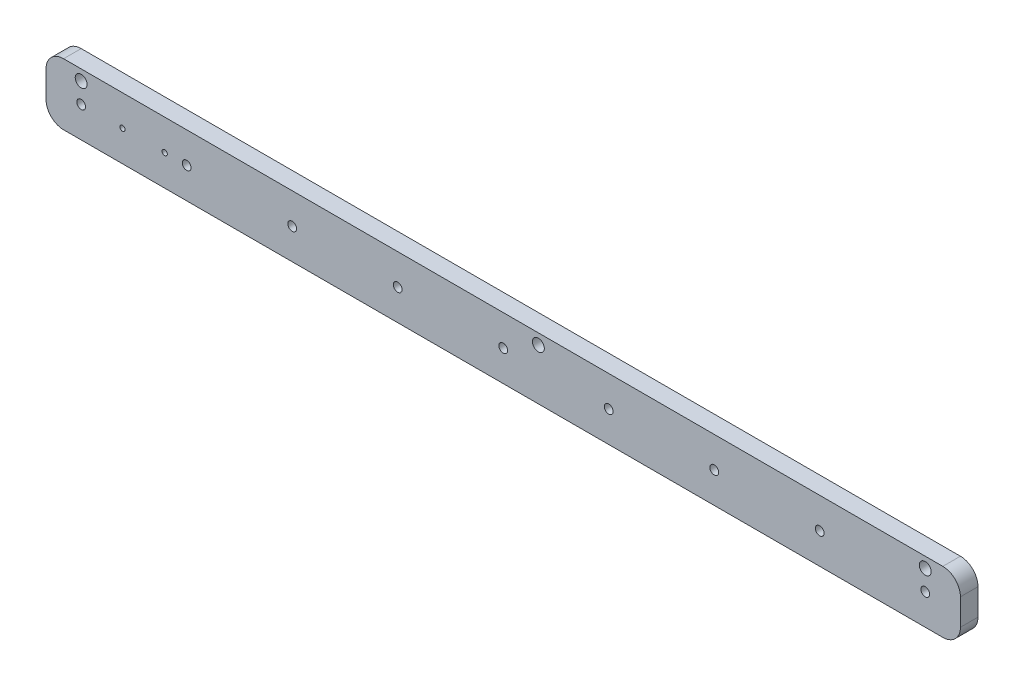
ISO-10303-21;
HEADER;
FILE_DESCRIPTION(('STEP AP214'),'2;1');
FILE_NAME('part.step','',(''),(''),'','','');
FILE_SCHEMA(('AUTOMOTIVE_DESIGN { 1 0 10303 214 1 1 1 1 }'));
ENDSEC;
DATA;
#1=APPLICATION_CONTEXT('core data for automotive mechanical design processes');
#2=APPLICATION_PROTOCOL_DEFINITION('international standard','automotive_design',2000,#1);
#3=PRODUCT_CONTEXT('',#1,'mechanical');
#4=PRODUCT('Part','Part','',(#3));
#5=PRODUCT_RELATED_PRODUCT_CATEGORY('part','',(#4));
#6=PRODUCT_DEFINITION_FORMATION('','',#4);
#7=PRODUCT_DEFINITION_CONTEXT('part definition',#1,'design');
#8=PRODUCT_DEFINITION('design','',#6,#7);
#9=PRODUCT_DEFINITION_SHAPE('','',#8);
#10=(LENGTH_UNIT() NAMED_UNIT(*) SI_UNIT(.MILLI.,.METRE.));
#11=(NAMED_UNIT(*) PLANE_ANGLE_UNIT() SI_UNIT($,.RADIAN.));
#12=(NAMED_UNIT(*) SI_UNIT($,.STERADIAN.) SOLID_ANGLE_UNIT());
#13=UNCERTAINTY_MEASURE_WITH_UNIT(LENGTH_MEASURE(1.E-05),#10,'distance_accuracy_value','');
#14=(GEOMETRIC_REPRESENTATION_CONTEXT(3) GLOBAL_UNCERTAINTY_ASSIGNED_CONTEXT((#13)) GLOBAL_UNIT_ASSIGNED_CONTEXT((#10,
#11,#12)) REPRESENTATION_CONTEXT('',''));
#15=CARTESIAN_POINT('',(0.,0.,0.));
#16=DIRECTION('',(0.,0.,1.));
#17=DIRECTION('',(1.,0.,0.));
#18=AXIS2_PLACEMENT_3D('',#15,#16,#17);
#19=CARTESIAN_POINT('',(240.,0.,10.));
#20=DIRECTION('',(0.,0.,-1.));
#21=DIRECTION('',(-1.,0.,0.));
#22=AXIS2_PLACEMENT_3D('',#19,#20,#21);
#23=CYLINDRICAL_SURFACE('',#22,6.99999999999998);
#24=CARTESIAN_POINT('',(240.,0.,0.));
#25=DIRECTION('',(0.,0.,1.));
#26=DIRECTION('',(1.,0.,0.));
#27=AXIS2_PLACEMENT_3D('',#24,#25,#26);
#28=CIRCLE('',#27,6.99999999999998);
#29=CARTESIAN_POINT('',(247.,0.,0.));
#30=VERTEX_POINT('',#29);
#31=EDGE_CURVE('E203',#30,#30,#28,.T.);
#32=ORIENTED_EDGE('',*,*,#31,.F.);
#33=EDGE_LOOP('',(#32));
#34=FACE_BOUND('',#33,.T.);
#35=CARTESIAN_POINT('',(240.,0.,6.));
#36=DIRECTION('',(0.,0.,1.));
#37=DIRECTION('',(1.,0.,0.));
#38=AXIS2_PLACEMENT_3D('',#35,#36,#37);
#39=CIRCLE('',#38,7.00000000000001);
#40=CARTESIAN_POINT('',(247.,0.,6.));
#41=VERTEX_POINT('',#40);
#42=EDGE_CURVE('E276',#41,#41,#39,.T.);
#43=ORIENTED_EDGE('',*,*,#42,.T.);
#44=EDGE_LOOP('',(#43));
#45=FACE_BOUND('',#44,.T.);
#46=ADVANCED_FACE('F33',(#34,#45),#23,.F.);
#47=CARTESIAN_POINT('',(180.,0.,10.));
#48=DIRECTION('',(0.,0.,-1.));
#49=DIRECTION('',(-1.,0.,0.));
#50=AXIS2_PLACEMENT_3D('',#47,#48,#49);
#51=CYLINDRICAL_SURFACE('',#50,6.99999999999998);
#52=CARTESIAN_POINT('',(180.,0.,0.));
#53=DIRECTION('',(0.,0.,1.));
#54=DIRECTION('',(1.,0.,0.));
#55=AXIS2_PLACEMENT_3D('',#52,#53,#54);
#56=CIRCLE('',#55,6.99999999999998);
#57=CARTESIAN_POINT('',(187.,0.,0.));
#58=VERTEX_POINT('',#57);
#59=EDGE_CURVE('E200',#58,#58,#56,.T.);
#60=ORIENTED_EDGE('',*,*,#59,.F.);
#61=EDGE_LOOP('',(#60));
#62=FACE_BOUND('',#61,.T.);
#63=CARTESIAN_POINT('',(180.,0.,6.));
#64=DIRECTION('',(0.,0.,1.));
#65=DIRECTION('',(1.,0.,0.));
#66=AXIS2_PLACEMENT_3D('',#63,#64,#65);
#67=CIRCLE('',#66,7.00000000000001);
#68=CARTESIAN_POINT('',(187.,0.,6.));
#69=VERTEX_POINT('',#68);
#70=EDGE_CURVE('E267',#69,#69,#67,.T.);
#71=ORIENTED_EDGE('',*,*,#70,.T.);
#72=EDGE_LOOP('',(#71));
#73=FACE_BOUND('',#72,.T.);
#74=ADVANCED_FACE('F357',(#62,#73),#51,.F.);
#75=CARTESIAN_POINT('',(120.,0.,10.));
#76=DIRECTION('',(0.,0.,-1.));
#77=DIRECTION('',(-1.,0.,0.));
#78=AXIS2_PLACEMENT_3D('',#75,#76,#77);
#79=CYLINDRICAL_SURFACE('',#78,7.00000000000001);
#80=CARTESIAN_POINT('',(120.,0.,0.));
#81=DIRECTION('',(0.,0.,1.));
#82=DIRECTION('',(1.,0.,0.));
#83=AXIS2_PLACEMENT_3D('',#80,#81,#82);
#84=CIRCLE('',#83,7.00000000000001);
#85=CARTESIAN_POINT('',(127.,0.,0.));
#86=VERTEX_POINT('',#85);
#87=EDGE_CURVE('E197',#86,#86,#84,.T.);
#88=ORIENTED_EDGE('',*,*,#87,.F.);
#89=EDGE_LOOP('',(#88));
#90=FACE_BOUND('',#89,.T.);
#91=CARTESIAN_POINT('',(120.,0.,6.));
#92=DIRECTION('',(0.,0.,1.));
#93=DIRECTION('',(1.,0.,0.));
#94=AXIS2_PLACEMENT_3D('',#91,#92,#93);
#95=CIRCLE('',#94,7.00000000000001);
#96=CARTESIAN_POINT('',(127.,0.,6.));
#97=VERTEX_POINT('',#96);
#98=EDGE_CURVE('E258',#97,#97,#95,.T.);
#99=ORIENTED_EDGE('',*,*,#98,.T.);
#100=EDGE_LOOP('',(#99));
#101=FACE_BOUND('',#100,.T.);
#102=ADVANCED_FACE('F363',(#90,#101),#79,.F.);
#103=CARTESIAN_POINT('',(60.0000000000001,0.,10.));
#104=DIRECTION('',(0.,0.,-1.));
#105=DIRECTION('',(-1.,0.,0.));
#106=AXIS2_PLACEMENT_3D('',#103,#104,#105);
#107=CYLINDRICAL_SURFACE('',#106,7.00000000000002);
#108=CARTESIAN_POINT('',(60.0000000000001,0.,0.));
#109=DIRECTION('',(0.,0.,1.));
#110=DIRECTION('',(1.,0.,0.));
#111=AXIS2_PLACEMENT_3D('',#108,#109,#110);
#112=CIRCLE('',#111,7.00000000000002);
#113=CARTESIAN_POINT('',(67.0000000000001,0.,0.));
#114=VERTEX_POINT('',#113);
#115=EDGE_CURVE('E194',#114,#114,#112,.T.);
#116=ORIENTED_EDGE('',*,*,#115,.F.);
#117=EDGE_LOOP('',(#116));
#118=FACE_BOUND('',#117,.T.);
#119=CARTESIAN_POINT('',(60.0000000000001,0.,6.));
#120=DIRECTION('',(0.,0.,1.));
#121=DIRECTION('',(1.,0.,0.));
#122=AXIS2_PLACEMENT_3D('',#119,#120,#121);
#123=CIRCLE('',#122,7.00000000000002);
#124=CARTESIAN_POINT('',(67.0000000000001,0.,6.));
#125=VERTEX_POINT('',#124);
#126=EDGE_CURVE('E249',#125,#125,#123,.T.);
#127=ORIENTED_EDGE('',*,*,#126,.T.);
#128=EDGE_LOOP('',(#127));
#129=FACE_BOUND('',#128,.T.);
#130=ADVANCED_FACE('F374',(#118,#129),#107,.F.);
#131=CARTESIAN_POINT('',(0.,0.,10.));
#132=DIRECTION('',(0.,0.,-1.));
#133=DIRECTION('',(-1.,0.,0.));
#134=AXIS2_PLACEMENT_3D('',#131,#132,#133);
#135=CYLINDRICAL_SURFACE('',#134,7.);
#136=CARTESIAN_POINT('',(0.,0.,0.));
#137=DIRECTION('',(0.,0.,1.));
#138=DIRECTION('',(1.,0.,0.));
#139=AXIS2_PLACEMENT_3D('',#136,#137,#138);
#140=CIRCLE('',#139,7.);
#141=CARTESIAN_POINT('',(7.00000000000006,0.,0.));
#142=VERTEX_POINT('',#141);
#143=EDGE_CURVE('E191',#142,#142,#140,.T.);
#144=ORIENTED_EDGE('',*,*,#143,.F.);
#145=EDGE_LOOP('',(#144));
#146=FACE_BOUND('',#145,.T.);
#147=CARTESIAN_POINT('',(0.,0.,6.));
#148=DIRECTION('',(0.,0.,1.));
#149=DIRECTION('',(1.,0.,0.));
#150=AXIS2_PLACEMENT_3D('',#147,#148,#149);
#151=CIRCLE('',#150,7.00000000000002);
#152=CARTESIAN_POINT('',(7.00000000000007,0.,6.));
#153=VERTEX_POINT('',#152);
#154=EDGE_CURVE('E240',#153,#153,#151,.T.);
#155=ORIENTED_EDGE('',*,*,#154,.T.);
#156=EDGE_LOOP('',(#155));
#157=FACE_BOUND('',#156,.T.);
#158=ADVANCED_FACE('F378',(#146,#157),#135,.F.);
#159=CARTESIAN_POINT('',(-59.9999999999999,0.,10.));
#160=DIRECTION('',(0.,0.,-1.));
#161=DIRECTION('',(-1.,0.,0.));
#162=AXIS2_PLACEMENT_3D('',#159,#160,#161);
#163=CYLINDRICAL_SURFACE('',#162,7.00000000000001);
#164=CARTESIAN_POINT('',(-59.9999999999999,0.,0.));
#165=DIRECTION('',(0.,0.,1.));
#166=DIRECTION('',(1.,0.,0.));
#167=AXIS2_PLACEMENT_3D('',#164,#165,#166);
#168=CIRCLE('',#167,7.00000000000001);
#169=CARTESIAN_POINT('',(-52.9999999999999,0.,0.));
#170=VERTEX_POINT('',#169);
#171=EDGE_CURVE('E188',#170,#170,#168,.T.);
#172=ORIENTED_EDGE('',*,*,#171,.F.);
#173=EDGE_LOOP('',(#172));
#174=FACE_BOUND('',#173,.T.);
#175=CARTESIAN_POINT('',(-59.9999999999999,0.,6.));
#176=DIRECTION('',(0.,0.,1.));
#177=DIRECTION('',(1.,0.,0.));
#178=AXIS2_PLACEMENT_3D('',#175,#176,#177);
#179=CIRCLE('',#178,7.00000000000001);
#180=CARTESIAN_POINT('',(-52.9999999999999,0.,6.));
#181=VERTEX_POINT('',#180);
#182=EDGE_CURVE('E231',#181,#181,#179,.T.);
#183=ORIENTED_EDGE('',*,*,#182,.T.);
#184=EDGE_LOOP('',(#183));
#185=FACE_BOUND('',#184,.T.);
#186=ADVANCED_FACE('F382',(#174,#185),#163,.F.);
#187=CARTESIAN_POINT('',(-120.,0.,10.));
#188=DIRECTION('',(0.,0.,-1.));
#189=DIRECTION('',(-1.,0.,0.));
#190=AXIS2_PLACEMENT_3D('',#187,#188,#189);
#191=CYLINDRICAL_SURFACE('',#190,7.00000000000002);
#192=CARTESIAN_POINT('',(-120.,0.,0.));
#193=DIRECTION('',(0.,0.,1.));
#194=DIRECTION('',(1.,0.,0.));
#195=AXIS2_PLACEMENT_3D('',#192,#193,#194);
#196=CIRCLE('',#195,7.00000000000002);
#197=CARTESIAN_POINT('',(-113.,0.,0.));
#198=VERTEX_POINT('',#197);
#199=EDGE_CURVE('E185',#198,#198,#196,.T.);
#200=ORIENTED_EDGE('',*,*,#199,.F.);
#201=EDGE_LOOP('',(#200));
#202=FACE_BOUND('',#201,.T.);
#203=CARTESIAN_POINT('',(-120.,0.,6.));
#204=DIRECTION('',(0.,0.,1.));
#205=DIRECTION('',(1.,0.,0.));
#206=AXIS2_PLACEMENT_3D('',#203,#204,#205);
#207=CIRCLE('',#206,7.00000000000002);
#208=CARTESIAN_POINT('',(-113.,0.,6.));
#209=VERTEX_POINT('',#208);
#210=EDGE_CURVE('E222',#209,#209,#207,.T.);
#211=ORIENTED_EDGE('',*,*,#210,.T.);
#212=EDGE_LOOP('',(#211));
#213=FACE_BOUND('',#212,.T.);
#214=ADVANCED_FACE('F386',(#202,#213),#191,.F.);
#215=CARTESIAN_POINT('',(-180.,0.,10.));
#216=DIRECTION('',(0.,0.,-1.));
#217=DIRECTION('',(-1.,0.,0.));
#218=AXIS2_PLACEMENT_3D('',#215,#216,#217);
#219=CYLINDRICAL_SURFACE('',#218,7.00000000000001);
#220=CARTESIAN_POINT('',(-180.,0.,0.));
#221=DIRECTION('',(0.,0.,1.));
#222=DIRECTION('',(1.,0.,0.));
#223=AXIS2_PLACEMENT_3D('',#220,#221,#222);
#224=CIRCLE('',#223,7.00000000000001);
#225=CARTESIAN_POINT('',(-173.,0.,0.));
#226=VERTEX_POINT('',#225);
#227=EDGE_CURVE('E182',#226,#226,#224,.T.);
#228=ORIENTED_EDGE('',*,*,#227,.F.);
#229=EDGE_LOOP('',(#228));
#230=FACE_BOUND('',#229,.T.);
#231=CARTESIAN_POINT('',(-180.,0.,6.));
#232=DIRECTION('',(0.,0.,1.));
#233=DIRECTION('',(1.,0.,0.));
#234=AXIS2_PLACEMENT_3D('',#231,#232,#233);
#235=CIRCLE('',#234,7.00000000000001);
#236=CARTESIAN_POINT('',(-173.,0.,6.));
#237=VERTEX_POINT('',#236);
#238=EDGE_CURVE('E213',#237,#237,#235,.T.);
#239=ORIENTED_EDGE('',*,*,#238,.T.);
#240=EDGE_LOOP('',(#239));
#241=FACE_BOUND('',#240,.T.);
#242=ADVANCED_FACE('F390',(#230,#241),#219,.F.);
#243=CARTESIAN_POINT('',(-240.,0.,10.));
#244=DIRECTION('',(0.,0.,-1.));
#245=DIRECTION('',(-1.,0.,0.));
#246=AXIS2_PLACEMENT_3D('',#243,#244,#245);
#247=CYLINDRICAL_SURFACE('',#246,7.00000000000001);
#248=CARTESIAN_POINT('',(-240.,0.,0.));
#249=DIRECTION('',(0.,0.,1.));
#250=DIRECTION('',(1.,0.,0.));
#251=AXIS2_PLACEMENT_3D('',#248,#249,#250);
#252=CIRCLE('',#251,7.00000000000001);
#253=CARTESIAN_POINT('',(-233.,0.,0.));
#254=VERTEX_POINT('',#253);
#255=EDGE_CURVE('E135',#254,#254,#252,.T.);
#256=ORIENTED_EDGE('',*,*,#255,.F.);
#257=EDGE_LOOP('',(#256));
#258=FACE_BOUND('',#257,.T.);
#259=CARTESIAN_POINT('',(-240.,0.,6.));
#260=DIRECTION('',(0.,0.,1.));
#261=DIRECTION('',(1.,0.,0.));
#262=AXIS2_PLACEMENT_3D('',#259,#260,#261);
#263=CIRCLE('',#262,7.00000000000001);
#264=CARTESIAN_POINT('',(-233.,0.,6.));
#265=VERTEX_POINT('',#264);
#266=EDGE_CURVE('E206',#265,#265,#263,.T.);
#267=ORIENTED_EDGE('',*,*,#266,.T.);
#268=EDGE_LOOP('',(#267));
#269=FACE_BOUND('',#268,.T.);
#270=ADVANCED_FACE('F329',(#258,#269),#247,.F.);
#271=CARTESIAN_POINT('',(250.,-7.5,10.));
#272=DIRECTION('',(0.,0.,1.));
#273=DIRECTION('',(1.,0.,0.));
#274=AXIS2_PLACEMENT_3D('',#271,#272,#273);
#275=PLANE('',#274);
#276=CARTESIAN_POINT('',(-192.499999843538,0.,10.));
#277=DIRECTION('',(0.,0.,1.));
#278=DIRECTION('',(1.,0.,0.));
#279=AXIS2_PLACEMENT_3D('',#276,#277,#278);
#280=CIRCLE('',#279,1.5);
#281=CARTESIAN_POINT('',(-190.999999843538,0.,10.));
#282=VERTEX_POINT('',#281);
#283=EDGE_CURVE('E312',#282,#282,#280,.T.);
#284=ORIENTED_EDGE('',*,*,#283,.F.);
#285=EDGE_LOOP('',(#284));
#286=FACE_BOUND('',#285,.T.);
#287=CARTESIAN_POINT('',(-216.499999843538,0.,10.));
#288=DIRECTION('',(0.,0.,1.));
#289=DIRECTION('',(1.,0.,0.));
#290=AXIS2_PLACEMENT_3D('',#287,#288,#289);
#291=CIRCLE('',#290,1.5);
#292=CARTESIAN_POINT('',(-214.999999843538,0.,10.));
#293=VERTEX_POINT('',#292);
#294=EDGE_CURVE('E306',#293,#293,#291,.T.);
#295=ORIENTED_EDGE('',*,*,#294,.F.);
#296=EDGE_LOOP('',(#295));
#297=FACE_BOUND('',#296,.T.);
#298=CARTESIAN_POINT('',(240.000000156462,11.5000003129244,10.));
#299=DIRECTION('',(0.,0.,1.));
#300=DIRECTION('',(1.,0.,0.));
#301=AXIS2_PLACEMENT_3D('',#298,#299,#300);
#302=CIRCLE('',#301,3.37499999999999);
#303=CARTESIAN_POINT('',(243.375000156462,11.5000003129244,10.));
#304=VERTEX_POINT('',#303);
#305=EDGE_CURVE('E300',#304,#304,#302,.T.);
#306=ORIENTED_EDGE('',*,*,#305,.F.);
#307=EDGE_LOOP('',(#306));
#308=FACE_BOUND('',#307,.T.);
#309=CARTESIAN_POINT('',(20.0000001564622,11.5000003129244,10.));
#310=DIRECTION('',(0.,0.,1.));
#311=DIRECTION('',(1.,0.,0.));
#312=AXIS2_PLACEMENT_3D('',#309,#310,#311);
#313=CIRCLE('',#312,3.37499999999996);
#314=CARTESIAN_POINT('',(23.3750001564621,11.5000003129244,10.));
#315=VERTEX_POINT('',#314);
#316=EDGE_CURVE('E295',#315,#315,#313,.T.);
#317=ORIENTED_EDGE('',*,*,#316,.F.);
#318=EDGE_LOOP('',(#317));
#319=FACE_BOUND('',#318,.T.);
#320=CARTESIAN_POINT('',(-239.999999843538,11.5000003129244,10.));
#321=DIRECTION('',(0.,0.,1.));
#322=DIRECTION('',(1.,0.,0.));
#323=AXIS2_PLACEMENT_3D('',#320,#321,#322);
#324=CIRCLE('',#323,3.37499999999999);
#325=CARTESIAN_POINT('',(-236.624999843538,11.5000003129244,10.));
#326=VERTEX_POINT('',#325);
#327=EDGE_CURVE('E288',#326,#326,#324,.T.);
#328=ORIENTED_EDGE('',*,*,#327,.F.);
#329=EDGE_LOOP('',(#328));
#330=FACE_BOUND('',#329,.T.);
#331=CARTESIAN_POINT('',(250.,-7.5,10.));
#332=DIRECTION('',(0.,0.,1.));
#333=DIRECTION('',(1.,0.,0.));
#334=AXIS2_PLACEMENT_3D('',#331,#332,#333);
#335=CIRCLE('',#334,10.);
#336=CARTESIAN_POINT('',(250.,-17.5,10.));
#337=VERTEX_POINT('',#336);
#338=CARTESIAN_POINT('',(260.,-7.5,10.));
#339=VERTEX_POINT('',#338);
#340=EDGE_CURVE('E146',#337,#339,#335,.T.);
#341=ORIENTED_EDGE('',*,*,#340,.T.);
#342=DIRECTION('',(0.,1.,0.));
#343=VECTOR('',#342,1.);
#344=CARTESIAN_POINT('',(260.,7.5,10.));
#345=LINE('',#344,#343);
#346=CARTESIAN_POINT('',(260.,7.5,10.));
#347=VERTEX_POINT('',#346);
#348=EDGE_CURVE('E93',#339,#347,#345,.T.);
#349=ORIENTED_EDGE('',*,*,#348,.T.);
#350=CARTESIAN_POINT('',(250.,7.5,10.));
#351=DIRECTION('',(0.,0.,1.));
#352=DIRECTION('',(-1.,0.,0.));
#353=AXIS2_PLACEMENT_3D('',#350,#351,#352);
#354=CIRCLE('',#353,10.);
#355=CARTESIAN_POINT('',(250.,17.5,10.));
#356=VERTEX_POINT('',#355);
#357=EDGE_CURVE('E161',#347,#356,#354,.T.);
#358=ORIENTED_EDGE('',*,*,#357,.T.);
#359=DIRECTION('',(-1.,0.,0.));
#360=VECTOR('',#359,1.);
#361=CARTESIAN_POINT('',(-250.,17.5,10.));
#362=LINE('',#361,#360);
#363=CARTESIAN_POINT('',(-250.,17.5,10.));
#364=VERTEX_POINT('',#363);
#365=EDGE_CURVE('E174',#356,#364,#362,.T.);
#366=ORIENTED_EDGE('',*,*,#365,.T.);
#367=CARTESIAN_POINT('',(-250.,7.5,10.));
#368=DIRECTION('',(0.,0.,1.));
#369=DIRECTION('',(1.,0.,0.));
#370=AXIS2_PLACEMENT_3D('',#367,#368,#369);
#371=CIRCLE('',#370,10.);
#372=CARTESIAN_POINT('',(-260.,7.5,10.));
#373=VERTEX_POINT('',#372);
#374=EDGE_CURVE('E113',#364,#373,#371,.T.);
#375=ORIENTED_EDGE('',*,*,#374,.T.);
#376=DIRECTION('',(0.,-1.,0.));
#377=VECTOR('',#376,1.);
#378=CARTESIAN_POINT('',(-260.,7.5,10.));
#379=LINE('',#378,#377);
#380=CARTESIAN_POINT('',(-260.,-7.5,10.));
#381=VERTEX_POINT('',#380);
#382=EDGE_CURVE('E106',#373,#381,#379,.T.);
#383=ORIENTED_EDGE('',*,*,#382,.T.);
#384=CARTESIAN_POINT('',(-250.,-7.5,10.));
#385=DIRECTION('',(0.,0.,1.));
#386=DIRECTION('',(1.,0.,0.));
#387=AXIS2_PLACEMENT_3D('',#384,#385,#386);
#388=CIRCLE('',#387,10.);
#389=CARTESIAN_POINT('',(-250.,-17.5,10.));
#390=VERTEX_POINT('',#389);
#391=EDGE_CURVE('E111',#381,#390,#388,.T.);
#392=ORIENTED_EDGE('',*,*,#391,.T.);
#393=DIRECTION('',(1.,0.,0.));
#394=VECTOR('',#393,1.);
#395=CARTESIAN_POINT('',(-250.,-17.5,10.));
#396=LINE('',#395,#394);
#397=EDGE_CURVE('E50',#390,#337,#396,.T.);
#398=ORIENTED_EDGE('',*,*,#397,.T.);
#399=EDGE_LOOP('',(#341,#349,#358,#366,#375,#383,#392,#398));
#400=FACE_BOUND('',#399,.T.);
#401=CARTESIAN_POINT('',(-240.,0.,10.));
#402=DIRECTION('',(0.,0.,1.));
#403=DIRECTION('',(1.,0.,0.));
#404=AXIS2_PLACEMENT_3D('',#401,#402,#403);
#405=CIRCLE('',#404,2.5);
#406=CARTESIAN_POINT('',(-237.5,0.,10.));
#407=VERTEX_POINT('',#406);
#408=EDGE_CURVE('E210',#407,#407,#405,.T.);
#409=ORIENTED_EDGE('',*,*,#408,.F.);
#410=EDGE_LOOP('',(#409));
#411=FACE_BOUND('',#410,.T.);
#412=CARTESIAN_POINT('',(-180.,0.,10.));
#413=DIRECTION('',(0.,0.,1.));
#414=DIRECTION('',(1.,0.,0.));
#415=AXIS2_PLACEMENT_3D('',#412,#413,#414);
#416=CIRCLE('',#415,2.5);
#417=CARTESIAN_POINT('',(-177.5,0.,10.));
#418=VERTEX_POINT('',#417);
#419=EDGE_CURVE('E219',#418,#418,#416,.T.);
#420=ORIENTED_EDGE('',*,*,#419,.F.);
#421=EDGE_LOOP('',(#420));
#422=FACE_BOUND('',#421,.T.);
#423=CARTESIAN_POINT('',(-120.,0.,10.));
#424=DIRECTION('',(0.,0.,1.));
#425=DIRECTION('',(1.,0.,0.));
#426=AXIS2_PLACEMENT_3D('',#423,#424,#425);
#427=CIRCLE('',#426,2.5);
#428=CARTESIAN_POINT('',(-117.5,0.,10.));
#429=VERTEX_POINT('',#428);
#430=EDGE_CURVE('E228',#429,#429,#427,.T.);
#431=ORIENTED_EDGE('',*,*,#430,.F.);
#432=EDGE_LOOP('',(#431));
#433=FACE_BOUND('',#432,.T.);
#434=CARTESIAN_POINT('',(-59.9999999999999,0.,10.));
#435=DIRECTION('',(0.,0.,1.));
#436=DIRECTION('',(1.,0.,0.));
#437=AXIS2_PLACEMENT_3D('',#434,#435,#436);
#438=CIRCLE('',#437,2.49999999999999);
#439=CARTESIAN_POINT('',(-57.5,0.,10.));
#440=VERTEX_POINT('',#439);
#441=EDGE_CURVE('E237',#440,#440,#438,.T.);
#442=ORIENTED_EDGE('',*,*,#441,.F.);
#443=EDGE_LOOP('',(#442));
#444=FACE_BOUND('',#443,.T.);
#445=CARTESIAN_POINT('',(0.,0.,10.));
#446=DIRECTION('',(0.,0.,1.));
#447=DIRECTION('',(1.,0.,0.));
#448=AXIS2_PLACEMENT_3D('',#445,#446,#447);
#449=CIRCLE('',#448,2.5);
#450=CARTESIAN_POINT('',(2.50000000000005,0.,10.));
#451=VERTEX_POINT('',#450);
#452=EDGE_CURVE('E246',#451,#451,#449,.T.);
#453=ORIENTED_EDGE('',*,*,#452,.F.);
#454=EDGE_LOOP('',(#453));
#455=FACE_BOUND('',#454,.T.);
#456=CARTESIAN_POINT('',(60.0000000000001,0.,10.));
#457=DIRECTION('',(0.,0.,1.));
#458=DIRECTION('',(1.,0.,0.));
#459=AXIS2_PLACEMENT_3D('',#456,#457,#458);
#460=CIRCLE('',#459,2.5);
#461=CARTESIAN_POINT('',(62.5000000000001,0.,10.));
#462=VERTEX_POINT('',#461);
#463=EDGE_CURVE('E255',#462,#462,#460,.T.);
#464=ORIENTED_EDGE('',*,*,#463,.F.);
#465=EDGE_LOOP('',(#464));
#466=FACE_BOUND('',#465,.T.);
#467=CARTESIAN_POINT('',(120.,0.,10.));
#468=DIRECTION('',(0.,0.,1.));
#469=DIRECTION('',(1.,0.,0.));
#470=AXIS2_PLACEMENT_3D('',#467,#468,#469);
#471=CIRCLE('',#470,2.49999999999999);
#472=CARTESIAN_POINT('',(122.5,0.,10.));
#473=VERTEX_POINT('',#472);
#474=EDGE_CURVE('E264',#473,#473,#471,.T.);
#475=ORIENTED_EDGE('',*,*,#474,.F.);
#476=EDGE_LOOP('',(#475));
#477=FACE_BOUND('',#476,.T.);
#478=CARTESIAN_POINT('',(180.,0.,10.));
#479=DIRECTION('',(0.,0.,1.));
#480=DIRECTION('',(1.,0.,0.));
#481=AXIS2_PLACEMENT_3D('',#478,#479,#480);
#482=CIRCLE('',#481,2.5);
#483=CARTESIAN_POINT('',(182.5,0.,10.));
#484=VERTEX_POINT('',#483);
#485=EDGE_CURVE('E273',#484,#484,#482,.T.);
#486=ORIENTED_EDGE('',*,*,#485,.F.);
#487=EDGE_LOOP('',(#486));
#488=FACE_BOUND('',#487,.T.);
#489=CARTESIAN_POINT('',(240.,0.,10.));
#490=DIRECTION('',(0.,0.,1.));
#491=DIRECTION('',(1.,0.,0.));
#492=AXIS2_PLACEMENT_3D('',#489,#490,#491);
#493=CIRCLE('',#492,2.5);
#494=CARTESIAN_POINT('',(242.5,0.,10.));
#495=VERTEX_POINT('',#494);
#496=EDGE_CURVE('E282',#495,#495,#493,.T.);
#497=ORIENTED_EDGE('',*,*,#496,.F.);
#498=EDGE_LOOP('',(#497));
#499=FACE_BOUND('',#498,.T.);
#500=ADVANCED_FACE('F108',(#286,#297,#308,#319,#330,#400,#411,#422,#433,#444,#455,#466,#477,
#488,#499),#275,.T.);
#501=CARTESIAN_POINT('',(250.,-7.5,0.));
#502=DIRECTION('',(0.,0.,1.));
#503=DIRECTION('',(1.,0.,0.));
#504=AXIS2_PLACEMENT_3D('',#501,#502,#503);
#505=PLANE('',#504);
#506=CARTESIAN_POINT('',(-192.499999843538,0.,0.));
#507=DIRECTION('',(0.,0.,1.));
#508=DIRECTION('',(1.,0.,0.));
#509=AXIS2_PLACEMENT_3D('',#506,#507,#508);
#510=CIRCLE('',#509,1.5);
#511=CARTESIAN_POINT('',(-190.999999843538,0.,0.));
#512=VERTEX_POINT('',#511);
#513=EDGE_CURVE('E303',#512,#512,#510,.T.);
#514=ORIENTED_EDGE('',*,*,#513,.T.);
#515=EDGE_LOOP('',(#514));
#516=FACE_BOUND('',#515,.T.);
#517=CARTESIAN_POINT('',(-216.499999843538,0.,0.));
#518=DIRECTION('',(0.,0.,1.));
#519=DIRECTION('',(1.,0.,0.));
#520=AXIS2_PLACEMENT_3D('',#517,#518,#519);
#521=CIRCLE('',#520,1.5);
#522=CARTESIAN_POINT('',(-214.999999843538,0.,0.));
#523=VERTEX_POINT('',#522);
#524=EDGE_CURVE('E309',#523,#523,#521,.T.);
#525=ORIENTED_EDGE('',*,*,#524,.T.);
#526=EDGE_LOOP('',(#525));
#527=FACE_BOUND('',#526,.T.);
#528=CARTESIAN_POINT('',(240.000000156462,11.5000003129244,0.));
#529=DIRECTION('',(0.,0.,1.));
#530=DIRECTION('',(1.,0.,0.));
#531=AXIS2_PLACEMENT_3D('',#528,#529,#530);
#532=CIRCLE('',#531,3.37499999999999);
#533=CARTESIAN_POINT('',(243.375000156462,11.5000003129244,0.));
#534=VERTEX_POINT('',#533);
#535=EDGE_CURVE('E292',#534,#534,#532,.T.);
#536=ORIENTED_EDGE('',*,*,#535,.T.);
#537=EDGE_LOOP('',(#536));
#538=FACE_BOUND('',#537,.T.);
#539=CARTESIAN_POINT('',(20.0000001564622,11.5000003129244,0.));
#540=DIRECTION('',(0.,0.,1.));
#541=DIRECTION('',(1.,0.,0.));
#542=AXIS2_PLACEMENT_3D('',#539,#540,#541);
#543=CIRCLE('',#542,3.37499999999996);
#544=CARTESIAN_POINT('',(23.3750001564621,11.5000003129244,0.));
#545=VERTEX_POINT('',#544);
#546=EDGE_CURVE('E285',#545,#545,#543,.T.);
#547=ORIENTED_EDGE('',*,*,#546,.T.);
#548=EDGE_LOOP('',(#547));
#549=FACE_BOUND('',#548,.T.);
#550=CARTESIAN_POINT('',(-239.999999843538,11.5000003129244,0.));
#551=DIRECTION('',(0.,0.,1.));
#552=DIRECTION('',(1.,0.,0.));
#553=AXIS2_PLACEMENT_3D('',#550,#551,#552);
#554=CIRCLE('',#553,3.37499999999999);
#555=CARTESIAN_POINT('',(-236.624999843538,11.5000003129244,0.));
#556=VERTEX_POINT('',#555);
#557=EDGE_CURVE('E291',#556,#556,#554,.T.);
#558=ORIENTED_EDGE('',*,*,#557,.T.);
#559=EDGE_LOOP('',(#558));
#560=FACE_BOUND('',#559,.T.);
#561=CARTESIAN_POINT('',(250.,-7.5,0.));
#562=DIRECTION('',(0.,0.,1.));
#563=DIRECTION('',(1.,0.,0.));
#564=AXIS2_PLACEMENT_3D('',#561,#562,#563);
#565=CIRCLE('',#564,10.);
#566=CARTESIAN_POINT('',(250.,-17.5,0.));
#567=VERTEX_POINT('',#566);
#568=CARTESIAN_POINT('',(260.,-7.5,0.));
#569=VERTEX_POINT('',#568);
#570=EDGE_CURVE('E131',#567,#569,#565,.T.);
#571=ORIENTED_EDGE('',*,*,#570,.F.);
#572=DIRECTION('',(1.,0.,0.));
#573=VECTOR('',#572,1.);
#574=CARTESIAN_POINT('',(-250.,-17.5,0.));
#575=LINE('',#574,#573);
#576=CARTESIAN_POINT('',(-250.,-17.5,0.));
#577=VERTEX_POINT('',#576);
#578=EDGE_CURVE('E85',#577,#567,#575,.T.);
#579=ORIENTED_EDGE('',*,*,#578,.F.);
#580=CARTESIAN_POINT('',(-250.,-7.5,0.));
#581=DIRECTION('',(0.,0.,1.));
#582=DIRECTION('',(1.,0.,0.));
#583=AXIS2_PLACEMENT_3D('',#580,#581,#582);
#584=CIRCLE('',#583,10.);
#585=CARTESIAN_POINT('',(-260.,-7.5,0.));
#586=VERTEX_POINT('',#585);
#587=EDGE_CURVE('E79',#586,#577,#584,.T.);
#588=ORIENTED_EDGE('',*,*,#587,.F.);
#589=DIRECTION('',(0.,-1.,0.));
#590=VECTOR('',#589,1.);
#591=CARTESIAN_POINT('',(-260.,7.5,0.));
#592=LINE('',#591,#590);
#593=CARTESIAN_POINT('',(-260.,7.5,0.));
#594=VERTEX_POINT('',#593);
#595=EDGE_CURVE('E121',#594,#586,#592,.T.);
#596=ORIENTED_EDGE('',*,*,#595,.F.);
#597=CARTESIAN_POINT('',(-250.,7.5,0.));
#598=DIRECTION('',(0.,0.,1.));
#599=DIRECTION('',(1.,0.,0.));
#600=AXIS2_PLACEMENT_3D('',#597,#598,#599);
#601=CIRCLE('',#600,10.);
#602=CARTESIAN_POINT('',(-250.,17.5,0.));
#603=VERTEX_POINT('',#602);
#604=EDGE_CURVE('E141',#603,#594,#601,.T.);
#605=ORIENTED_EDGE('',*,*,#604,.F.);
#606=DIRECTION('',(-1.,0.,0.));
#607=VECTOR('',#606,1.);
#608=CARTESIAN_POINT('',(-250.,17.5,0.));
#609=LINE('',#608,#607);
#610=CARTESIAN_POINT('',(250.,17.5,0.));
#611=VERTEX_POINT('',#610);
#612=EDGE_CURVE('E139',#611,#603,#609,.T.);
#613=ORIENTED_EDGE('',*,*,#612,.F.);
#614=CARTESIAN_POINT('',(250.,7.5,0.));
#615=DIRECTION('',(0.,0.,1.));
#616=DIRECTION('',(-1.,0.,0.));
#617=AXIS2_PLACEMENT_3D('',#614,#615,#616);
#618=CIRCLE('',#617,10.);
#619=CARTESIAN_POINT('',(260.,7.5,0.));
#620=VERTEX_POINT('',#619);
#621=EDGE_CURVE('E137',#620,#611,#618,.T.);
#622=ORIENTED_EDGE('',*,*,#621,.F.);
#623=DIRECTION('',(0.,1.,0.));
#624=VECTOR('',#623,1.);
#625=CARTESIAN_POINT('',(260.,7.5,0.));
#626=LINE('',#625,#624);
#627=EDGE_CURVE('E134',#569,#620,#626,.T.);
#628=ORIENTED_EDGE('',*,*,#627,.F.);
#629=EDGE_LOOP('',(#571,#579,#588,#596,#605,#613,#622,#628));
#630=FACE_BOUND('',#629,.T.);
#631=ORIENTED_EDGE('',*,*,#255,.T.);
#632=EDGE_LOOP('',(#631));
#633=FACE_BOUND('',#632,.T.);
#634=ORIENTED_EDGE('',*,*,#227,.T.);
#635=EDGE_LOOP('',(#634));
#636=FACE_BOUND('',#635,.T.);
#637=ORIENTED_EDGE('',*,*,#199,.T.);
#638=EDGE_LOOP('',(#637));
#639=FACE_BOUND('',#638,.T.);
#640=ORIENTED_EDGE('',*,*,#171,.T.);
#641=EDGE_LOOP('',(#640));
#642=FACE_BOUND('',#641,.T.);
#643=ORIENTED_EDGE('',*,*,#143,.T.);
#644=EDGE_LOOP('',(#643));
#645=FACE_BOUND('',#644,.T.);
#646=ORIENTED_EDGE('',*,*,#115,.T.);
#647=EDGE_LOOP('',(#646));
#648=FACE_BOUND('',#647,.T.);
#649=ORIENTED_EDGE('',*,*,#87,.T.);
#650=EDGE_LOOP('',(#649));
#651=FACE_BOUND('',#650,.T.);
#652=ORIENTED_EDGE('',*,*,#59,.T.);
#653=EDGE_LOOP('',(#652));
#654=FACE_BOUND('',#653,.T.);
#655=ORIENTED_EDGE('',*,*,#31,.T.);
#656=EDGE_LOOP('',(#655));
#657=FACE_BOUND('',#656,.T.);
#658=ADVANCED_FACE('F165',(#516,#527,#538,#549,#560,#630,#633,#636,#639,#642,#645,#648,#651,
#654,#657),#505,.F.);
#659=CARTESIAN_POINT('',(250.,-7.5,10.));
#660=DIRECTION('',(0.,0.,-1.));
#661=DIRECTION('',(-1.,0.,0.));
#662=AXIS2_PLACEMENT_3D('',#659,#660,#661);
#663=CYLINDRICAL_SURFACE('',#662,10.);
#664=ORIENTED_EDGE('',*,*,#570,.T.);
#665=DIRECTION('',(0.,0.,-1.));
#666=VECTOR('',#665,1.);
#667=CARTESIAN_POINT('',(260.,-7.5,10.));
#668=LINE('',#667,#666);
#669=EDGE_CURVE('E11',#339,#569,#668,.T.);
#670=ORIENTED_EDGE('',*,*,#669,.F.);
#671=ORIENTED_EDGE('',*,*,#340,.F.);
#672=DIRECTION('',(0.,0.,-1.));
#673=VECTOR('',#672,1.);
#674=CARTESIAN_POINT('',(250.,-17.5,10.));
#675=LINE('',#674,#673);
#676=EDGE_CURVE('E127',#337,#567,#675,.T.);
#677=ORIENTED_EDGE('',*,*,#676,.T.);
#678=EDGE_LOOP('',(#664,#670,#671,#677));
#679=FACE_BOUND('',#678,.T.);
#680=ADVANCED_FACE('F35',(#679),#663,.T.);
#681=CARTESIAN_POINT('',(260.,7.5,10.));
#682=DIRECTION('',(-1.,0.,0.));
#683=DIRECTION('',(0.,0.,1.));
#684=AXIS2_PLACEMENT_3D('',#681,#682,#683);
#685=PLANE('',#684);
#686=ORIENTED_EDGE('',*,*,#627,.T.);
#687=DIRECTION('',(0.,0.,-1.));
#688=VECTOR('',#687,1.);
#689=CARTESIAN_POINT('',(260.,7.5,10.));
#690=LINE('',#689,#688);
#691=EDGE_CURVE('E42',#347,#620,#690,.T.);
#692=ORIENTED_EDGE('',*,*,#691,.F.);
#693=ORIENTED_EDGE('',*,*,#348,.F.);
#694=ORIENTED_EDGE('',*,*,#669,.T.);
#695=EDGE_LOOP('',(#686,#692,#693,#694));
#696=FACE_BOUND('',#695,.T.);
#697=ADVANCED_FACE('F412',(#696),#685,.F.);
#698=CARTESIAN_POINT('',(250.,7.5,10.));
#699=DIRECTION('',(0.,0.,-1.));
#700=DIRECTION('',(-1.,0.,0.));
#701=AXIS2_PLACEMENT_3D('',#698,#699,#700);
#702=CYLINDRICAL_SURFACE('',#701,10.);
#703=ORIENTED_EDGE('',*,*,#621,.T.);
#704=DIRECTION('',(0.,0.,-1.));
#705=VECTOR('',#704,1.);
#706=CARTESIAN_POINT('',(250.,17.5,10.));
#707=LINE('',#706,#705);
#708=EDGE_CURVE('E153',#356,#611,#707,.T.);
#709=ORIENTED_EDGE('',*,*,#708,.F.);
#710=ORIENTED_EDGE('',*,*,#357,.F.);
#711=ORIENTED_EDGE('',*,*,#691,.T.);
#712=EDGE_LOOP('',(#703,#709,#710,#711));
#713=FACE_BOUND('',#712,.T.);
#714=ADVANCED_FACE('F159',(#713),#702,.T.);
#715=CARTESIAN_POINT('',(-250.,17.5,10.));
#716=DIRECTION('',(0.,-1.,0.));
#717=DIRECTION('',(0.,0.,-1.));
#718=AXIS2_PLACEMENT_3D('',#715,#716,#717);
#719=PLANE('',#718);
#720=ORIENTED_EDGE('',*,*,#612,.T.);
#721=DIRECTION('',(0.,0.,-1.));
#722=VECTOR('',#721,1.);
#723=CARTESIAN_POINT('',(-250.,17.5,10.));
#724=LINE('',#723,#722);
#725=EDGE_CURVE('E150',#364,#603,#724,.T.);
#726=ORIENTED_EDGE('',*,*,#725,.F.);
#727=ORIENTED_EDGE('',*,*,#365,.F.);
#728=ORIENTED_EDGE('',*,*,#708,.T.);
#729=EDGE_LOOP('',(#720,#726,#727,#728));
#730=FACE_BOUND('',#729,.T.);
#731=ADVANCED_FACE('F170',(#730),#719,.F.);
#732=CARTESIAN_POINT('',(-250.,7.5,10.));
#733=DIRECTION('',(0.,0.,-1.));
#734=DIRECTION('',(-1.,0.,0.));
#735=AXIS2_PLACEMENT_3D('',#732,#733,#734);
#736=CYLINDRICAL_SURFACE('',#735,10.);
#737=ORIENTED_EDGE('',*,*,#604,.T.);
#738=DIRECTION('',(0.,0.,-1.));
#739=VECTOR('',#738,1.);
#740=CARTESIAN_POINT('',(-260.,7.5,10.));
#741=LINE('',#740,#739);
#742=EDGE_CURVE('E122',#373,#594,#741,.T.);
#743=ORIENTED_EDGE('',*,*,#742,.F.);
#744=ORIENTED_EDGE('',*,*,#374,.F.);
#745=ORIENTED_EDGE('',*,*,#725,.T.);
#746=EDGE_LOOP('',(#737,#743,#744,#745));
#747=FACE_BOUND('',#746,.T.);
#748=ADVANCED_FACE('F173',(#747),#736,.T.);
#749=CARTESIAN_POINT('',(-260.,7.5,10.));
#750=DIRECTION('',(1.,0.,0.));
#751=DIRECTION('',(0.,0.,-1.));
#752=AXIS2_PLACEMENT_3D('',#749,#750,#751);
#753=PLANE('',#752);
#754=ORIENTED_EDGE('',*,*,#595,.T.);
#755=DIRECTION('',(0.,0.,-1.));
#756=VECTOR('',#755,1.);
#757=CARTESIAN_POINT('',(-260.,-7.5,10.));
#758=LINE('',#757,#756);
#759=EDGE_CURVE('E118',#381,#586,#758,.T.);
#760=ORIENTED_EDGE('',*,*,#759,.F.);
#761=ORIENTED_EDGE('',*,*,#382,.F.);
#762=ORIENTED_EDGE('',*,*,#742,.T.);
#763=EDGE_LOOP('',(#754,#760,#761,#762));
#764=FACE_BOUND('',#763,.T.);
#765=ADVANCED_FACE('F119',(#764),#753,.F.);
#766=CARTESIAN_POINT('',(-250.,-7.5,10.));
#767=DIRECTION('',(0.,0.,-1.));
#768=DIRECTION('',(-1.,0.,0.));
#769=AXIS2_PLACEMENT_3D('',#766,#767,#768);
#770=CYLINDRICAL_SURFACE('',#769,10.);
#771=ORIENTED_EDGE('',*,*,#587,.T.);
#772=DIRECTION('',(0.,0.,-1.));
#773=VECTOR('',#772,1.);
#774=CARTESIAN_POINT('',(-250.,-17.5,10.));
#775=LINE('',#774,#773);
#776=EDGE_CURVE('E123',#390,#577,#775,.T.);
#777=ORIENTED_EDGE('',*,*,#776,.F.);
#778=ORIENTED_EDGE('',*,*,#391,.F.);
#779=ORIENTED_EDGE('',*,*,#759,.T.);
#780=EDGE_LOOP('',(#771,#777,#778,#779));
#781=FACE_BOUND('',#780,.T.);
#782=ADVANCED_FACE('F125',(#781),#770,.T.);
#783=CARTESIAN_POINT('',(-250.,-17.5,10.));
#784=DIRECTION('',(0.,1.,0.));
#785=DIRECTION('',(0.,0.,1.));
#786=AXIS2_PLACEMENT_3D('',#783,#784,#785);
#787=PLANE('',#786);
#788=ORIENTED_EDGE('',*,*,#578,.T.);
#789=ORIENTED_EDGE('',*,*,#676,.F.);
#790=ORIENTED_EDGE('',*,*,#397,.F.);
#791=ORIENTED_EDGE('',*,*,#776,.T.);
#792=EDGE_LOOP('',(#788,#789,#790,#791));
#793=FACE_BOUND('',#792,.T.);
#794=ADVANCED_FACE('F400',(#793),#787,.F.);
#795=CARTESIAN_POINT('',(-240.,0.,6.));
#796=DIRECTION('',(0.,0.,1.));
#797=DIRECTION('',(1.,0.,0.));
#798=AXIS2_PLACEMENT_3D('',#795,#796,#797);
#799=PLANE('',#798);
#800=CARTESIAN_POINT('',(-240.,0.,6.));
#801=DIRECTION('',(0.,0.,1.));
#802=DIRECTION('',(1.,0.,0.));
#803=AXIS2_PLACEMENT_3D('',#800,#801,#802);
#804=CIRCLE('',#803,2.5);
#805=CARTESIAN_POINT('',(-237.5,0.,6.));
#806=VERTEX_POINT('',#805);
#807=EDGE_CURVE('E209',#806,#806,#804,.T.);
#808=ORIENTED_EDGE('',*,*,#807,.T.);
#809=EDGE_LOOP('',(#808));
#810=FACE_BOUND('',#809,.T.);
#811=ORIENTED_EDGE('',*,*,#266,.F.);
#812=EDGE_LOOP('',(#811));
#813=FACE_BOUND('',#812,.T.);
#814=ADVANCED_FACE('F369',(#810,#813),#799,.F.);
#815=CARTESIAN_POINT('',(-240.,0.,6.));
#816=DIRECTION('',(0.,0.,1.));
#817=DIRECTION('',(1.,0.,0.));
#818=AXIS2_PLACEMENT_3D('',#815,#816,#817);
#819=CYLINDRICAL_SURFACE('',#818,2.5);
#820=ORIENTED_EDGE('',*,*,#807,.F.);
#821=EDGE_LOOP('',(#820));
#822=FACE_BOUND('',#821,.T.);
#823=ORIENTED_EDGE('',*,*,#408,.T.);
#824=EDGE_LOOP('',(#823));
#825=FACE_BOUND('',#824,.T.);
#826=ADVANCED_FACE('F526',(#822,#825),#819,.F.);
#827=CARTESIAN_POINT('',(-180.,0.,6.));
#828=DIRECTION('',(0.,0.,1.));
#829=DIRECTION('',(1.,0.,0.));
#830=AXIS2_PLACEMENT_3D('',#827,#828,#829);
#831=PLANE('',#830);
#832=CARTESIAN_POINT('',(-180.,0.,6.));
#833=DIRECTION('',(0.,0.,1.));
#834=DIRECTION('',(1.,0.,0.));
#835=AXIS2_PLACEMENT_3D('',#832,#833,#834);
#836=CIRCLE('',#835,2.5);
#837=CARTESIAN_POINT('',(-177.5,0.,6.));
#838=VERTEX_POINT('',#837);
#839=EDGE_CURVE('E218',#838,#838,#836,.T.);
#840=ORIENTED_EDGE('',*,*,#839,.T.);
#841=EDGE_LOOP('',(#840));
#842=FACE_BOUND('',#841,.T.);
#843=ORIENTED_EDGE('',*,*,#238,.F.);
#844=EDGE_LOOP('',(#843));
#845=FACE_BOUND('',#844,.T.);
#846=ADVANCED_FACE('F532',(#842,#845),#831,.F.);
#847=CARTESIAN_POINT('',(-180.,0.,6.));
#848=DIRECTION('',(0.,0.,1.));
#849=DIRECTION('',(1.,0.,0.));
#850=AXIS2_PLACEMENT_3D('',#847,#848,#849);
#851=CYLINDRICAL_SURFACE('',#850,2.5);
#852=ORIENTED_EDGE('',*,*,#839,.F.);
#853=EDGE_LOOP('',(#852));
#854=FACE_BOUND('',#853,.T.);
#855=ORIENTED_EDGE('',*,*,#419,.T.);
#856=EDGE_LOOP('',(#855));
#857=FACE_BOUND('',#856,.T.);
#858=ADVANCED_FACE('F539',(#854,#857),#851,.F.);
#859=CARTESIAN_POINT('',(-120.,0.,6.));
#860=DIRECTION('',(0.,0.,1.));
#861=DIRECTION('',(1.,0.,0.));
#862=AXIS2_PLACEMENT_3D('',#859,#860,#861);
#863=PLANE('',#862);
#864=CARTESIAN_POINT('',(-120.,0.,6.));
#865=DIRECTION('',(0.,0.,1.));
#866=DIRECTION('',(1.,0.,0.));
#867=AXIS2_PLACEMENT_3D('',#864,#865,#866);
#868=CIRCLE('',#867,2.5);
#869=CARTESIAN_POINT('',(-117.5,0.,6.));
#870=VERTEX_POINT('',#869);
#871=EDGE_CURVE('E227',#870,#870,#868,.T.);
#872=ORIENTED_EDGE('',*,*,#871,.T.);
#873=EDGE_LOOP('',(#872));
#874=FACE_BOUND('',#873,.T.);
#875=ORIENTED_EDGE('',*,*,#210,.F.);
#876=EDGE_LOOP('',(#875));
#877=FACE_BOUND('',#876,.T.);
#878=ADVANCED_FACE('F547',(#874,#877),#863,.F.);
#879=CARTESIAN_POINT('',(-120.,0.,6.));
#880=DIRECTION('',(0.,0.,1.));
#881=DIRECTION('',(1.,0.,0.));
#882=AXIS2_PLACEMENT_3D('',#879,#880,#881);
#883=CYLINDRICAL_SURFACE('',#882,2.5);
#884=ORIENTED_EDGE('',*,*,#871,.F.);
#885=EDGE_LOOP('',(#884));
#886=FACE_BOUND('',#885,.T.);
#887=ORIENTED_EDGE('',*,*,#430,.T.);
#888=EDGE_LOOP('',(#887));
#889=FACE_BOUND('',#888,.T.);
#890=ADVANCED_FACE('F555',(#886,#889),#883,.F.);
#891=CARTESIAN_POINT('',(-59.9999999999999,0.,6.));
#892=DIRECTION('',(0.,0.,1.));
#893=DIRECTION('',(1.,0.,0.));
#894=AXIS2_PLACEMENT_3D('',#891,#892,#893);
#895=PLANE('',#894);
#896=CARTESIAN_POINT('',(-59.9999999999999,0.,6.));
#897=DIRECTION('',(0.,0.,1.));
#898=DIRECTION('',(1.,0.,0.));
#899=AXIS2_PLACEMENT_3D('',#896,#897,#898);
#900=CIRCLE('',#899,2.49999999999999);
#901=CARTESIAN_POINT('',(-57.5,0.,6.));
#902=VERTEX_POINT('',#901);
#903=EDGE_CURVE('E236',#902,#902,#900,.T.);
#904=ORIENTED_EDGE('',*,*,#903,.T.);
#905=EDGE_LOOP('',(#904));
#906=FACE_BOUND('',#905,.T.);
#907=ORIENTED_EDGE('',*,*,#182,.F.);
#908=EDGE_LOOP('',(#907));
#909=FACE_BOUND('',#908,.T.);
#910=ADVANCED_FACE('F563',(#906,#909),#895,.F.);
#911=CARTESIAN_POINT('',(-59.9999999999999,0.,6.));
#912=DIRECTION('',(0.,0.,1.));
#913=DIRECTION('',(1.,0.,0.));
#914=AXIS2_PLACEMENT_3D('',#911,#912,#913);
#915=CYLINDRICAL_SURFACE('',#914,2.49999999999999);
#916=ORIENTED_EDGE('',*,*,#903,.F.);
#917=EDGE_LOOP('',(#916));
#918=FACE_BOUND('',#917,.T.);
#919=ORIENTED_EDGE('',*,*,#441,.T.);
#920=EDGE_LOOP('',(#919));
#921=FACE_BOUND('',#920,.T.);
#922=ADVANCED_FACE('F571',(#918,#921),#915,.F.);
#923=CARTESIAN_POINT('',(0.,0.,6.));
#924=DIRECTION('',(0.,0.,1.));
#925=DIRECTION('',(1.,0.,0.));
#926=AXIS2_PLACEMENT_3D('',#923,#924,#925);
#927=PLANE('',#926);
#928=CARTESIAN_POINT('',(0.,0.,6.));
#929=DIRECTION('',(0.,0.,1.));
#930=DIRECTION('',(1.,0.,0.));
#931=AXIS2_PLACEMENT_3D('',#928,#929,#930);
#932=CIRCLE('',#931,2.5);
#933=CARTESIAN_POINT('',(2.50000000000005,0.,6.));
#934=VERTEX_POINT('',#933);
#935=EDGE_CURVE('E245',#934,#934,#932,.T.);
#936=ORIENTED_EDGE('',*,*,#935,.T.);
#937=EDGE_LOOP('',(#936));
#938=FACE_BOUND('',#937,.T.);
#939=ORIENTED_EDGE('',*,*,#154,.F.);
#940=EDGE_LOOP('',(#939));
#941=FACE_BOUND('',#940,.T.);
#942=ADVANCED_FACE('F579',(#938,#941),#927,.F.);
#943=CARTESIAN_POINT('',(0.,0.,6.));
#944=DIRECTION('',(0.,0.,1.));
#945=DIRECTION('',(1.,0.,0.));
#946=AXIS2_PLACEMENT_3D('',#943,#944,#945);
#947=CYLINDRICAL_SURFACE('',#946,2.5);
#948=ORIENTED_EDGE('',*,*,#935,.F.);
#949=EDGE_LOOP('',(#948));
#950=FACE_BOUND('',#949,.T.);
#951=ORIENTED_EDGE('',*,*,#452,.T.);
#952=EDGE_LOOP('',(#951));
#953=FACE_BOUND('',#952,.T.);
#954=ADVANCED_FACE('F587',(#950,#953),#947,.F.);
#955=CARTESIAN_POINT('',(60.0000000000001,0.,6.));
#956=DIRECTION('',(0.,0.,1.));
#957=DIRECTION('',(1.,0.,0.));
#958=AXIS2_PLACEMENT_3D('',#955,#956,#957);
#959=PLANE('',#958);
#960=CARTESIAN_POINT('',(60.0000000000001,0.,6.));
#961=DIRECTION('',(0.,0.,1.));
#962=DIRECTION('',(1.,0.,0.));
#963=AXIS2_PLACEMENT_3D('',#960,#961,#962);
#964=CIRCLE('',#963,2.5);
#965=CARTESIAN_POINT('',(62.5000000000001,0.,6.));
#966=VERTEX_POINT('',#965);
#967=EDGE_CURVE('E254',#966,#966,#964,.T.);
#968=ORIENTED_EDGE('',*,*,#967,.T.);
#969=EDGE_LOOP('',(#968));
#970=FACE_BOUND('',#969,.T.);
#971=ORIENTED_EDGE('',*,*,#126,.F.);
#972=EDGE_LOOP('',(#971));
#973=FACE_BOUND('',#972,.T.);
#974=ADVANCED_FACE('F595',(#970,#973),#959,.F.);
#975=CARTESIAN_POINT('',(60.0000000000001,0.,6.));
#976=DIRECTION('',(0.,0.,1.));
#977=DIRECTION('',(1.,0.,0.));
#978=AXIS2_PLACEMENT_3D('',#975,#976,#977);
#979=CYLINDRICAL_SURFACE('',#978,2.5);
#980=ORIENTED_EDGE('',*,*,#967,.F.);
#981=EDGE_LOOP('',(#980));
#982=FACE_BOUND('',#981,.T.);
#983=ORIENTED_EDGE('',*,*,#463,.T.);
#984=EDGE_LOOP('',(#983));
#985=FACE_BOUND('',#984,.T.);
#986=ADVANCED_FACE('F603',(#982,#985),#979,.F.);
#987=CARTESIAN_POINT('',(120.,0.,6.));
#988=DIRECTION('',(0.,0.,1.));
#989=DIRECTION('',(1.,0.,0.));
#990=AXIS2_PLACEMENT_3D('',#987,#988,#989);
#991=PLANE('',#990);
#992=CARTESIAN_POINT('',(120.,0.,6.));
#993=DIRECTION('',(0.,0.,1.));
#994=DIRECTION('',(1.,0.,0.));
#995=AXIS2_PLACEMENT_3D('',#992,#993,#994);
#996=CIRCLE('',#995,2.49999999999999);
#997=CARTESIAN_POINT('',(122.5,0.,6.));
#998=VERTEX_POINT('',#997);
#999=EDGE_CURVE('E263',#998,#998,#996,.T.);
#1000=ORIENTED_EDGE('',*,*,#999,.T.);
#1001=EDGE_LOOP('',(#1000));
#1002=FACE_BOUND('',#1001,.T.);
#1003=ORIENTED_EDGE('',*,*,#98,.F.);
#1004=EDGE_LOOP('',(#1003));
#1005=FACE_BOUND('',#1004,.T.);
#1006=ADVANCED_FACE('F611',(#1002,#1005),#991,.F.);
#1007=CARTESIAN_POINT('',(120.,0.,6.));
#1008=DIRECTION('',(0.,0.,1.));
#1009=DIRECTION('',(1.,0.,0.));
#1010=AXIS2_PLACEMENT_3D('',#1007,#1008,#1009);
#1011=CYLINDRICAL_SURFACE('',#1010,2.49999999999999);
#1012=ORIENTED_EDGE('',*,*,#999,.F.);
#1013=EDGE_LOOP('',(#1012));
#1014=FACE_BOUND('',#1013,.T.);
#1015=ORIENTED_EDGE('',*,*,#474,.T.);
#1016=EDGE_LOOP('',(#1015));
#1017=FACE_BOUND('',#1016,.T.);
#1018=ADVANCED_FACE('F619',(#1014,#1017),#1011,.F.);
#1019=CARTESIAN_POINT('',(180.,0.,6.));
#1020=DIRECTION('',(0.,0.,1.));
#1021=DIRECTION('',(1.,0.,0.));
#1022=AXIS2_PLACEMENT_3D('',#1019,#1020,#1021);
#1023=PLANE('',#1022);
#1024=CARTESIAN_POINT('',(180.,0.,6.));
#1025=DIRECTION('',(0.,0.,1.));
#1026=DIRECTION('',(1.,0.,0.));
#1027=AXIS2_PLACEMENT_3D('',#1024,#1025,#1026);
#1028=CIRCLE('',#1027,2.5);
#1029=CARTESIAN_POINT('',(182.5,0.,6.));
#1030=VERTEX_POINT('',#1029);
#1031=EDGE_CURVE('E272',#1030,#1030,#1028,.T.);
#1032=ORIENTED_EDGE('',*,*,#1031,.T.);
#1033=EDGE_LOOP('',(#1032));
#1034=FACE_BOUND('',#1033,.T.);
#1035=ORIENTED_EDGE('',*,*,#70,.F.);
#1036=EDGE_LOOP('',(#1035));
#1037=FACE_BOUND('',#1036,.T.);
#1038=ADVANCED_FACE('F627',(#1034,#1037),#1023,.F.);
#1039=CARTESIAN_POINT('',(180.,0.,6.));
#1040=DIRECTION('',(0.,0.,1.));
#1041=DIRECTION('',(1.,0.,0.));
#1042=AXIS2_PLACEMENT_3D('',#1039,#1040,#1041);
#1043=CYLINDRICAL_SURFACE('',#1042,2.5);
#1044=ORIENTED_EDGE('',*,*,#1031,.F.);
#1045=EDGE_LOOP('',(#1044));
#1046=FACE_BOUND('',#1045,.T.);
#1047=ORIENTED_EDGE('',*,*,#485,.T.);
#1048=EDGE_LOOP('',(#1047));
#1049=FACE_BOUND('',#1048,.T.);
#1050=ADVANCED_FACE('F635',(#1046,#1049),#1043,.F.);
#1051=CARTESIAN_POINT('',(240.,0.,6.));
#1052=DIRECTION('',(0.,0.,1.));
#1053=DIRECTION('',(1.,0.,0.));
#1054=AXIS2_PLACEMENT_3D('',#1051,#1052,#1053);
#1055=PLANE('',#1054);
#1056=CARTESIAN_POINT('',(240.,0.,6.));
#1057=DIRECTION('',(0.,0.,1.));
#1058=DIRECTION('',(1.,0.,0.));
#1059=AXIS2_PLACEMENT_3D('',#1056,#1057,#1058);
#1060=CIRCLE('',#1059,2.5);
#1061=CARTESIAN_POINT('',(242.5,0.,6.));
#1062=VERTEX_POINT('',#1061);
#1063=EDGE_CURVE('E281',#1062,#1062,#1060,.T.);
#1064=ORIENTED_EDGE('',*,*,#1063,.T.);
#1065=EDGE_LOOP('',(#1064));
#1066=FACE_BOUND('',#1065,.T.);
#1067=ORIENTED_EDGE('',*,*,#42,.F.);
#1068=EDGE_LOOP('',(#1067));
#1069=FACE_BOUND('',#1068,.T.);
#1070=ADVANCED_FACE('F352',(#1066,#1069),#1055,.F.);
#1071=CARTESIAN_POINT('',(240.,0.,6.));
#1072=DIRECTION('',(0.,0.,1.));
#1073=DIRECTION('',(1.,0.,0.));
#1074=AXIS2_PLACEMENT_3D('',#1071,#1072,#1073);
#1075=CYLINDRICAL_SURFACE('',#1074,2.5);
#1076=ORIENTED_EDGE('',*,*,#1063,.F.);
#1077=EDGE_LOOP('',(#1076));
#1078=FACE_BOUND('',#1077,.T.);
#1079=ORIENTED_EDGE('',*,*,#496,.T.);
#1080=EDGE_LOOP('',(#1079));
#1081=FACE_BOUND('',#1080,.T.);
#1082=ADVANCED_FACE('F342',(#1078,#1081),#1075,.F.);
#1083=CARTESIAN_POINT('',(-239.999999843538,11.5000003129244,0.));
#1084=DIRECTION('',(0.,0.,1.));
#1085=DIRECTION('',(1.,0.,0.));
#1086=AXIS2_PLACEMENT_3D('',#1083,#1084,#1085);
#1087=CYLINDRICAL_SURFACE('',#1086,3.37499999999999);
#1088=ORIENTED_EDGE('',*,*,#557,.F.);
#1089=EDGE_LOOP('',(#1088));
#1090=FACE_BOUND('',#1089,.T.);
#1091=ORIENTED_EDGE('',*,*,#327,.T.);
#1092=EDGE_LOOP('',(#1091));
#1093=FACE_BOUND('',#1092,.T.);
#1094=ADVANCED_FACE('F339',(#1090,#1093),#1087,.F.);
#1095=CARTESIAN_POINT('',(20.0000001564622,11.5000003129244,0.));
#1096=DIRECTION('',(0.,0.,1.));
#1097=DIRECTION('',(1.,0.,0.));
#1098=AXIS2_PLACEMENT_3D('',#1095,#1096,#1097);
#1099=CYLINDRICAL_SURFACE('',#1098,3.37499999999996);
#1100=ORIENTED_EDGE('',*,*,#546,.F.);
#1101=EDGE_LOOP('',(#1100));
#1102=FACE_BOUND('',#1101,.T.);
#1103=ORIENTED_EDGE('',*,*,#316,.T.);
#1104=EDGE_LOOP('',(#1103));
#1105=FACE_BOUND('',#1104,.T.);
#1106=ADVANCED_FACE('F341',(#1102,#1105),#1099,.F.);
#1107=CARTESIAN_POINT('',(240.000000156462,11.5000003129244,0.));
#1108=DIRECTION('',(0.,0.,1.));
#1109=DIRECTION('',(1.,0.,0.));
#1110=AXIS2_PLACEMENT_3D('',#1107,#1108,#1109);
#1111=CYLINDRICAL_SURFACE('',#1110,3.37499999999999);
#1112=ORIENTED_EDGE('',*,*,#535,.F.);
#1113=EDGE_LOOP('',(#1112));
#1114=FACE_BOUND('',#1113,.T.);
#1115=ORIENTED_EDGE('',*,*,#305,.T.);
#1116=EDGE_LOOP('',(#1115));
#1117=FACE_BOUND('',#1116,.T.);
#1118=ADVANCED_FACE('F349',(#1114,#1117),#1111,.F.);
#1119=CARTESIAN_POINT('',(-216.499999843538,0.,0.));
#1120=DIRECTION('',(0.,0.,1.));
#1121=DIRECTION('',(1.,0.,0.));
#1122=AXIS2_PLACEMENT_3D('',#1119,#1120,#1121);
#1123=CYLINDRICAL_SURFACE('',#1122,1.5);
#1124=ORIENTED_EDGE('',*,*,#524,.F.);
#1125=EDGE_LOOP('',(#1124));
#1126=FACE_BOUND('',#1125,.T.);
#1127=ORIENTED_EDGE('',*,*,#294,.T.);
#1128=EDGE_LOOP('',(#1127));
#1129=FACE_BOUND('',#1128,.T.);
#1130=ADVANCED_FACE('F323',(#1126,#1129),#1123,.F.);
#1131=CARTESIAN_POINT('',(-192.499999843538,0.,0.));
#1132=DIRECTION('',(0.,0.,1.));
#1133=DIRECTION('',(1.,0.,0.));
#1134=AXIS2_PLACEMENT_3D('',#1131,#1132,#1133);
#1135=CYLINDRICAL_SURFACE('',#1134,1.5);
#1136=ORIENTED_EDGE('',*,*,#513,.F.);
#1137=EDGE_LOOP('',(#1136));
#1138=FACE_BOUND('',#1137,.T.);
#1139=ORIENTED_EDGE('',*,*,#283,.T.);
#1140=EDGE_LOOP('',(#1139));
#1141=FACE_BOUND('',#1140,.T.);
#1142=ADVANCED_FACE('F320',(#1138,#1141),#1135,.F.);
#1143=CLOSED_SHELL('',(#46,#74,#102,#130,#158,#186,#214,#242,#270,#500,#658,#680,#697,#714,#731,
#748,#765,#782,#794,#814,#826,#846,#858,#878,#890,#910,#922,#942,#954,#974,#986,#1006,#1018,
#1038,#1050,#1070,#1082,#1094,#1106,#1118,#1130,#1142));
#1144=MANIFOLD_SOLID_BREP('B2',#1143);
#1145=ADVANCED_BREP_SHAPE_REPRESENTATION('',(#18,#1144),#14);
#1146=SHAPE_DEFINITION_REPRESENTATION(#9,#1145);
ENDSEC;
END-ISO-10303-21;
